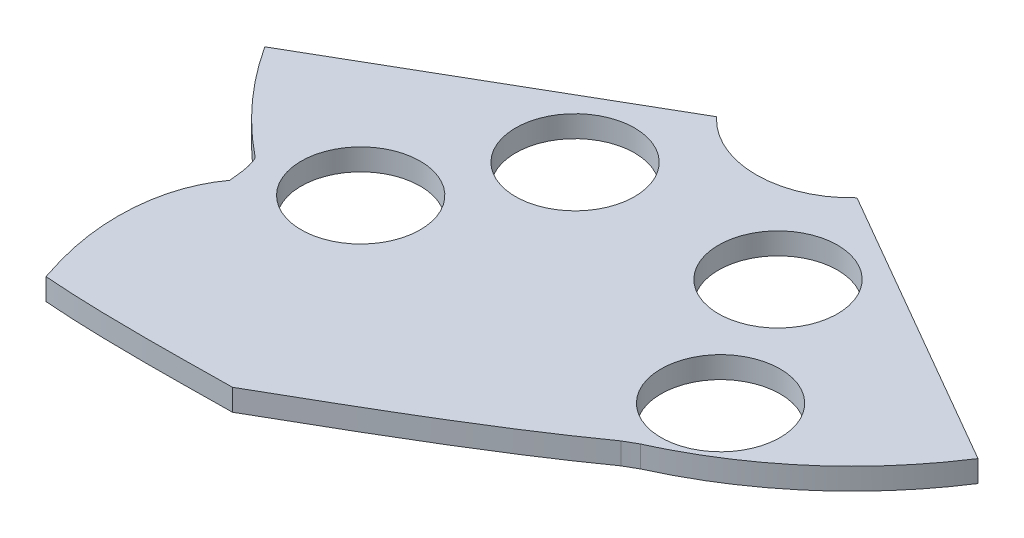
ISO-10303-21;
HEADER;
FILE_DESCRIPTION(('STEP AP214'),'2;1');
FILE_NAME('part.step','',(''),(''),'','','');
FILE_SCHEMA(('AUTOMOTIVE_DESIGN { 1 0 10303 214 1 1 1 1 }'));
ENDSEC;
DATA;
#1=APPLICATION_CONTEXT('core data for automotive mechanical design processes');
#2=APPLICATION_PROTOCOL_DEFINITION('international standard','automotive_design',2000,#1);
#3=PRODUCT_CONTEXT('',#1,'mechanical');
#4=PRODUCT('Part','Part','',(#3));
#5=PRODUCT_RELATED_PRODUCT_CATEGORY('part','',(#4));
#6=PRODUCT_DEFINITION_FORMATION('','',#4);
#7=PRODUCT_DEFINITION_CONTEXT('part definition',#1,'design');
#8=PRODUCT_DEFINITION('design','',#6,#7);
#9=PRODUCT_DEFINITION_SHAPE('','',#8);
#10=(LENGTH_UNIT() NAMED_UNIT(*) SI_UNIT(.MILLI.,.METRE.));
#11=(NAMED_UNIT(*) PLANE_ANGLE_UNIT() SI_UNIT($,.RADIAN.));
#12=(NAMED_UNIT(*) SI_UNIT($,.STERADIAN.) SOLID_ANGLE_UNIT());
#13=UNCERTAINTY_MEASURE_WITH_UNIT(LENGTH_MEASURE(1.E-05),#10,'distance_accuracy_value','');
#14=(GEOMETRIC_REPRESENTATION_CONTEXT(3) GLOBAL_UNCERTAINTY_ASSIGNED_CONTEXT((#13)) GLOBAL_UNIT_ASSIGNED_CONTEXT((#10,
#11,#12)) REPRESENTATION_CONTEXT('',''));
#15=CARTESIAN_POINT('',(0.,0.,0.));
#16=DIRECTION('',(0.,0.,1.));
#17=DIRECTION('',(1.,0.,0.));
#18=AXIS2_PLACEMENT_3D('',#15,#16,#17);
#19=CARTESIAN_POINT('',(-58.197961870647,-95.736,52.6805140965762));
#20=DIRECTION('',(0.,-1.,0.));
#21=DIRECTION('',(0.,0.,-1.));
#22=AXIS2_PLACEMENT_3D('',#19,#20,#21);
#23=PLANE('',#22);
#24=CARTESIAN_POINT('',(18.75,-95.736,32.476));
#25=DIRECTION('',(0.,-1.,0.));
#26=DIRECTION('',(0.,0.,-1.));
#27=AXIS2_PLACEMENT_3D('',#24,#25,#26);
#28=CIRCLE('',#27,10.999845998306);
#29=CARTESIAN_POINT('',(18.75,-95.736,21.476154001694));
#30=VERTEX_POINT('',#29);
#31=EDGE_CURVE('E441',#30,#30,#28,.T.);
#32=ORIENTED_EDGE('',*,*,#31,.F.);
#33=EDGE_LOOP('',(#32));
#34=FACE_BOUND('',#33,.T.);
#35=CARTESIAN_POINT('',(-33.25,-95.736,57.591));
#36=DIRECTION('',(0.,-1.,0.));
#37=DIRECTION('',(0.,0.,-1.));
#38=AXIS2_PLACEMENT_3D('',#35,#36,#37);
#39=CIRCLE('',#38,10.999845998306);
#40=CARTESIAN_POINT('',(-33.25,-95.736,46.591154001694));
#41=VERTEX_POINT('',#40);
#42=EDGE_CURVE('E422',#41,#41,#39,.T.);
#43=ORIENTED_EDGE('',*,*,#42,.F.);
#44=EDGE_LOOP('',(#43));
#45=FACE_BOUND('',#44,.T.);
#46=CARTESIAN_POINT('',(-65.8942438215736,-95.736,42.6629141284688));
#47=CARTESIAN_POINT('',(-64.7481896495349,-95.736,44.4323996427012));
#48=CARTESIAN_POINT('',(-63.5310462821573,-95.736,46.1567714999939));
#49=CARTESIAN_POINT('',(-60.9638535341546,-95.736,49.499221373882));
#50=CARTESIAN_POINT('',(-59.6126875987779,-95.736,51.1179637725432));
#51=CARTESIAN_POINT('',(-55.3684815127835,-95.736,55.8056466661798));
#52=CARTESIAN_POINT('',(-52.2875127768171,-95.736,58.7033318126828));
#53=CARTESIAN_POINT('',(-48.9943120143384,-95.736,61.3338771744565));
#54=B_SPLINE_CURVE_WITH_KNOTS('',3,(#46,#47,#48,#49,#50,#51,#52,#53),.UNSPECIFIED.,.F.,.F.,(4,2,
2,4),(7.65054686269195E-13,0.25,0.5,0.999998540788698),.UNSPECIFIED.);
#55=CARTESIAN_POINT('',(-48.9943120143384,-95.736,61.3338771744565));
#56=VERTEX_POINT('',#55);
#57=CARTESIAN_POINT('',(-65.8942438215736,-95.736,42.6629141284688));
#58=VERTEX_POINT('',#57);
#59=EDGE_CURVE('E378',#56,#58,#54,.F.);
#60=ORIENTED_EDGE('',*,*,#59,.T.);
#61=DIRECTION('',(0.866025113443951,0.,-0.500000502884138));
#62=VECTOR('',#61,1.);
#63=CARTESIAN_POINT('',(-65.8942438215736,-95.736,42.6629141284688));
#64=LINE('',#63,#62);
#65=CARTESIAN_POINT('',(-12.9766531358799,-95.736,12.1108879302399));
#66=VERTEX_POINT('',#65);
#67=EDGE_CURVE('E103',#58,#66,#64,.T.);
#68=ORIENTED_EDGE('',*,*,#67,.T.);
#69=CARTESIAN_POINT('',(0.,-95.736,0.));
#70=DIRECTION('',(0.,1.,0.));
#71=DIRECTION('',(0.,0.,-1.));
#72=AXIS2_PLACEMENT_3D('',#69,#70,#71);
#73=CIRCLE('',#72,17.7501305084715);
#74=CARTESIAN_POINT('',(12.9766531358511,-95.736,12.1108879302707));
#75=VERTEX_POINT('',#74);
#76=EDGE_CURVE('E272',#66,#75,#73,.T.);
#77=ORIENTED_EDGE('',*,*,#76,.T.);
#78=DIRECTION('',(0.866025113442765,0.,0.500000502886192));
#79=VECTOR('',#78,1.);
#80=CARTESIAN_POINT('',(12.9766531358511,-95.736,12.1108879302707));
#81=LINE('',#80,#79);
#82=CARTESIAN_POINT('',(65.8946490574718,-95.736,42.6631480920524));
#83=VERTEX_POINT('',#82);
#84=EDGE_CURVE('E249',#75,#83,#81,.T.);
#85=ORIENTED_EDGE('',*,*,#84,.T.);
#86=CARTESIAN_POINT('',(32.3639071630544,-95.736,71.518722381302));
#87=CARTESIAN_POINT('',(35.7674671190183,-95.736,69.9782224254637));
#88=CARTESIAN_POINT('',(39.0643190275716,-95.736,68.1916483133267));
#89=CARTESIAN_POINT('',(45.364161801316,-95.736,64.1747818871924));
#90=CARTESIAN_POINT('',(48.3714608468154,-95.736,61.9376791964968));
#91=CARTESIAN_POINT('',(54.0374701978777,-95.736,57.063705355286));
#92=CARTESIAN_POINT('',(56.6958287618017,-95.736,54.4237586405179));
#93=CARTESIAN_POINT('',(61.6087710037681,-95.736,48.792570508695));
#94=CARTESIAN_POINT('',(63.8637051430224,-95.736,45.8002856784584));
#95=CARTESIAN_POINT('',(65.8946490574718,-95.736,42.6631480920524));
#96=B_SPLINE_CURVE_WITH_KNOTS('',3,(#86,#87,#88,#89,#90,#91,#92,#93,#94,#95),.UNSPECIFIED.,.F.,
.F.,(4,2,2,2,4),(0.,0.25,0.5,0.75,1.),.UNSPECIFIED.);
#97=CARTESIAN_POINT('',(32.3639071630544,-95.736,71.518722381302));
#98=VERTEX_POINT('',#97);
#99=EDGE_CURVE('E244',#83,#98,#96,.F.);
#100=ORIENTED_EDGE('',*,*,#99,.T.);
#101=CARTESIAN_POINT('',(30.077254884467,-95.736,72.8251652501504));
#102=CARTESIAN_POINT('',(30.1822815859724,-95.736,72.7608434591795));
#103=CARTESIAN_POINT('',(30.3942944838775,-95.736,72.6309999584621));
#104=CARTESIAN_POINT('',(30.8284754594415,-95.736,72.3741288061626));
#105=CARTESIAN_POINT('',(31.3248703130237,-95.736,72.089895879078));
#106=CARTESIAN_POINT('',(31.8747778403471,-95.736,71.7837839646905));
#107=CARTESIAN_POINT('',(32.2031671533857,-95.736,71.6058281129184));
#108=CARTESIAN_POINT('',(32.3639060046392,-95.736,71.5187229056173));
#109=B_SPLINE_CURVE_WITH_KNOTS('',3,(#101,#102,#103,#104,#105,#106,#107,#108),.UNSPECIFIED.,.F.,
.F.,(4,1,1,1,1,4),(0.,0.14027370511467,0.283164429956061,0.574573360474114,0.791759110522628,
0.999991092705754),.UNSPECIFIED.);
#110=CARTESIAN_POINT('',(30.077254884467,-95.736,72.8251652501504));
#111=VERTEX_POINT('',#110);
#112=EDGE_CURVE('E321',#98,#111,#109,.F.);
#113=ORIENTED_EDGE('',*,*,#112,.T.);
#114=CARTESIAN_POINT('',(-14.3951371400716,-95.736,100.130753915315));
#115=CARTESIAN_POINT('',(-13.3505194752669,-95.736,99.5327428682483));
#116=CARTESIAN_POINT('',(-11.2568374365112,-95.736,98.3341751717552));
#117=CARTESIAN_POINT('',(-5.7832605826681,-95.736,95.200447991266));
#118=CARTESIAN_POINT('',(1.91635834766982,-95.736,90.7612949765773));
#119=CARTESIAN_POINT('',(10.0739724808193,-95.736,85.8977908397055));
#120=CARTESIAN_POINT('',(16.5511450939432,-95.736,81.8774082418066));
#121=CARTESIAN_POINT('',(20.209891139743,-95.736,79.5296141676809));
#122=CARTESIAN_POINT('',(22.7424082311937,-95.736,77.8604895717903));
#123=CARTESIAN_POINT('',(24.0005885586283,-95.736,77.0220259862925));
#124=CARTESIAN_POINT('',(25.2447472238097,-95.736,76.1833702154967));
#125=CARTESIAN_POINT('',(26.4745670243228,-95.736,75.3446559314633));
#126=CARTESIAN_POINT('',(27.6895914879721,-95.736,74.5057998801645));
#127=CARTESIAN_POINT('',(28.8899949092457,-95.736,73.6675717894459));
#128=CARTESIAN_POINT('',(29.6826448629567,-95.736,73.1051561953971));
#129=CARTESIAN_POINT('',(30.0772548844666,-95.736,72.8251652501507));
#130=B_SPLINE_CURVE_WITH_KNOTS('',3,(#114,#115,#116,#117,#118,#119,#120,#121,#122,#123,#124,
#125,#126,#127,#128,#129),.UNSPECIFIED.,.F.,.F.,(4,1,1,1,1,1,1,1,1,1,1,1,1,4),
(-3.13787668737575E-07,0.069165824377653,0.138626387680094,0.362423795133444,0.579865388634984,
0.684327218445521,0.800475338629621,0.829652659074383,0.858614847466929,0.88735588780722,
0.915870095582063,0.944152110308575,0.972196886922019,1.),.UNSPECIFIED.);
#131=CARTESIAN_POINT('',(-14.3951371400716,-95.736,100.130753915315));
#132=VERTEX_POINT('',#131);
#133=EDGE_CURVE('E129',#111,#132,#130,.F.);
#134=ORIENTED_EDGE('',*,*,#133,.T.);
#135=CARTESIAN_POINT('',(-1663.16783202955,-95.736,1225.68534199864));
#136=CARTESIAN_POINT('',(2145.36043449303,-95.736,-1017.7020330919));
#137=CARTESIAN_POINT('',(-2167.35248932832,-95.736,1203.40323210772));
#138=CARTESIAN_POINT('',(1630.56413160656,-95.736,-981.965569594921));
#139=B_SPLINE_CURVE_WITH_KNOTS('',3,(#135,#136,#137,#138),.UNSPECIFIED.,.F.,.F.,(4,4),
(-10.3601295168167,10.248315428923),.UNSPECIFIED.);
#140=CARTESIAN_POINT('',(-49.3379755412991,-95.736,99.655194420379));
#141=VERTEX_POINT('',#140);
#142=EDGE_CURVE('E122',#132,#141,#139,.T.);
#143=ORIENTED_EDGE('',*,*,#142,.T.);
#144=CARTESIAN_POINT('',(-47.7731350411802,-95.736,67.2598180144932));
#145=CARTESIAN_POINT('',(-47.9488920780134,-95.736,67.508087103161));
#146=CARTESIAN_POINT('',(-48.2990703182446,-95.736,68.0027376783242));
#147=CARTESIAN_POINT('',(-48.7818545278718,-95.736,68.7698311324327));
#148=CARTESIAN_POINT('',(-49.2316385330056,-95.736,69.550075772291));
#149=CARTESIAN_POINT('',(-49.64652227975,-95.736,70.3447350824898));
#150=CARTESIAN_POINT('',(-50.2947651724595,-95.736,71.7163706723563));
#151=CARTESIAN_POINT('',(-51.0575449694001,-95.736,73.7324366606143));
#152=CARTESIAN_POINT('',(-51.7478612752798,-95.736,76.4085463161939));
#153=CARTESIAN_POINT('',(-52.1817330682431,-95.736,79.1581680205615));
#154=CARTESIAN_POINT('',(-52.3812092269579,-95.736,81.9074536027439));
#155=CARTESIAN_POINT('',(-52.3792306383951,-95.736,84.7012368943906));
#156=CARTESIAN_POINT('',(-52.190220937294,-95.736,87.4607295575721));
#157=CARTESIAN_POINT('',(-51.8198059858523,-95.736,90.2057752203513));
#158=CARTESIAN_POINT('',(-51.3808357080297,-95.736,92.4425554728793));
#159=CARTESIAN_POINT('',(-50.9595894478412,-95.736,94.212202091745));
#160=CARTESIAN_POINT('',(-50.495357558151,-95.736,95.9715075066716));
#161=CARTESIAN_POINT('',(-50.0251720143132,-95.736,97.5398380463112));
#162=CARTESIAN_POINT('',(-49.5850622867533,-95.736,98.9097693595326));
#163=CARTESIAN_POINT('',(-49.4187341675323,-95.736,99.4115572970555));
#164=CARTESIAN_POINT('',(-49.3379755413036,-95.736,99.6551944203653));
#165=B_SPLINE_CURVE_WITH_KNOTS('',3,(#144,#145,#146,#147,#148,#149,#150,#151,#152,#153,#154,
#155,#156,#157,#158,#159,#160,#161,#162,#163,#164),.UNSPECIFIED.,.F.,.F.,(4,1,1,1,1,1,1,1,1,1,1,
1,1,1,1,1,1,1,4),(4.13669098975333E-13,0.0270960399667382,0.0539860901563884,0.0807130731809925,
0.107315140554032,0.133826285257707,0.215850018485879,0.298875168999364,0.379627917207236,
0.463525556109156,0.544195423014069,0.628342545375611,0.709755155334879,0.790814533726315,
0.831306351379741,0.871807447939199,0.952903982510329,0.977133406961988,1.00000061073529),.UNSPECIFIED.);
#166=CARTESIAN_POINT('',(-47.7731350411802,-95.736,67.2598180144931));
#167=VERTEX_POINT('',#166);
#168=EDGE_CURVE('E126',#141,#167,#165,.F.);
#169=ORIENTED_EDGE('',*,*,#168,.T.);
#170=CARTESIAN_POINT('',(-48.9943120143384,-95.736,61.3338771744565));
#171=CARTESIAN_POINT('',(-48.9594289712213,-95.736,61.4086133330928));
#172=CARTESIAN_POINT('',(-48.8902308995571,-95.736,61.5568686915449));
#173=CARTESIAN_POINT('',(-48.7948156576452,-95.736,61.7808521175198));
#174=CARTESIAN_POINT('',(-48.688599961713,-95.736,62.0482778834496));
#175=CARTESIAN_POINT('',(-48.5754372060929,-95.736,62.36412601051));
#176=CARTESIAN_POINT('',(-48.4238675008309,-95.736,62.8447534959303));
#177=CARTESIAN_POINT('',(-48.2640564263806,-95.736,63.4663486232066));
#178=CARTESIAN_POINT('',(-48.0681153772079,-95.736,64.4750318438346));
#179=CARTESIAN_POINT('',(-47.9401618449875,-95.736,65.5041010084014));
#180=CARTESIAN_POINT('',(-47.8411342939389,-95.736,66.5159136706272));
#181=CARTESIAN_POINT('',(-47.7954209086754,-95.736,67.0160128680909));
#182=CARTESIAN_POINT('',(-47.7731350411802,-95.736,67.2598180144931));
#183=B_SPLINE_CURVE_WITH_KNOTS('',3,(#170,#171,#172,#173,#174,#175,#176,#177,#178,#179,#180,
#181,#182),.UNSPECIFIED.,.F.,.F.,(4,1,1,1,1,1,1,1,1,1,4),(4.44540768462787E-06,
0.0406659330463773,0.0806653133872965,0.120017426231064,0.182525067935943,0.246033800807224,
0.368437163746651,0.498716091757652,0.752408434385871,0.879295752821847,1.),.UNSPECIFIED.);
#184=EDGE_CURVE('E51',#167,#56,#183,.F.);
#185=ORIENTED_EDGE('',*,*,#184,.T.);
#186=EDGE_LOOP('',(#60,#68,#77,#85,#100,#113,#134,#143,#169,#185));
#187=FACE_BOUND('',#186,.T.);
#188=CARTESIAN_POINT('',(33.25,-95.736,57.591));
#189=DIRECTION('',(0.,-1.,0.));
#190=DIRECTION('',(0.,0.,-1.));
#191=AXIS2_PLACEMENT_3D('',#188,#189,#190);
#192=CIRCLE('',#191,10.999845998306);
#193=CARTESIAN_POINT('',(33.25,-95.736,46.591154001694));
#194=VERTEX_POINT('',#193);
#195=EDGE_CURVE('E429',#194,#194,#192,.T.);
#196=ORIENTED_EDGE('',*,*,#195,.F.);
#197=EDGE_LOOP('',(#196));
#198=FACE_BOUND('',#197,.T.);
#199=CARTESIAN_POINT('',(-18.75,-95.736,32.476));
#200=DIRECTION('',(0.,-1.,0.));
#201=DIRECTION('',(0.,0.,-1.));
#202=AXIS2_PLACEMENT_3D('',#199,#200,#201);
#203=CIRCLE('',#202,10.999845998306);
#204=CARTESIAN_POINT('',(-18.75,-95.736,21.476154001694));
#205=VERTEX_POINT('',#204);
#206=EDGE_CURVE('E447',#205,#205,#203,.T.);
#207=ORIENTED_EDGE('',*,*,#206,.F.);
#208=EDGE_LOOP('',(#207));
#209=FACE_BOUND('',#208,.T.);
#210=ADVANCED_FACE('F30',(#34,#45,#187,#198,#209),#23,.T.);
#211=CARTESIAN_POINT('',(-58.197961870647,-91.736,52.6805140965762));
#212=DIRECTION('',(0.,-1.,0.));
#213=DIRECTION('',(0.,0.,-1.));
#214=AXIS2_PLACEMENT_3D('',#211,#212,#213);
#215=PLANE('',#214);
#216=CARTESIAN_POINT('',(18.75,-91.736,32.476));
#217=DIRECTION('',(0.,-1.,0.));
#218=DIRECTION('',(0.,0.,-1.));
#219=AXIS2_PLACEMENT_3D('',#216,#217,#218);
#220=CIRCLE('',#219,10.999845998306);
#221=CARTESIAN_POINT('',(18.75,-91.736,21.476154001694));
#222=VERTEX_POINT('',#221);
#223=EDGE_CURVE('E444',#222,#222,#220,.T.);
#224=ORIENTED_EDGE('',*,*,#223,.T.);
#225=EDGE_LOOP('',(#224));
#226=FACE_BOUND('',#225,.T.);
#227=CARTESIAN_POINT('',(-33.25,-91.736,57.591));
#228=DIRECTION('',(0.,-1.,0.));
#229=DIRECTION('',(0.,0.,-1.));
#230=AXIS2_PLACEMENT_3D('',#227,#228,#229);
#231=CIRCLE('',#230,10.999845998306);
#232=CARTESIAN_POINT('',(-33.25,-91.736,46.591154001694));
#233=VERTEX_POINT('',#232);
#234=EDGE_CURVE('E424',#233,#233,#231,.T.);
#235=ORIENTED_EDGE('',*,*,#234,.T.);
#236=EDGE_LOOP('',(#235));
#237=FACE_BOUND('',#236,.T.);
#238=CARTESIAN_POINT('',(-48.9943120143384,-91.736,61.3338771744565));
#239=CARTESIAN_POINT('',(-52.2875127768171,-91.736,58.7033318126828));
#240=CARTESIAN_POINT('',(-55.3684815127835,-91.736,55.8056466661798));
#241=CARTESIAN_POINT('',(-59.6126875987779,-91.736,51.1179637725432));
#242=CARTESIAN_POINT('',(-60.9638535341546,-91.736,49.499221373882));
#243=CARTESIAN_POINT('',(-63.5310462821573,-91.736,46.1567714999939));
#244=CARTESIAN_POINT('',(-64.7481896495349,-91.736,44.4323996427012));
#245=CARTESIAN_POINT('',(-65.8942438215736,-91.736,42.6629141284688));
#246=B_SPLINE_CURVE_WITH_KNOTS('',3,(#238,#239,#240,#241,#242,#243,#244,#245),.UNSPECIFIED.,.F.,
.F.,(4,2,2,4),(7.65061180345071E-13,0.499998540789463,0.749998540789463,0.999998540788698),.UNSPECIFIED.);
#247=CARTESIAN_POINT('',(-48.9943120143384,-91.736,61.3338771744565));
#248=VERTEX_POINT('',#247);
#249=CARTESIAN_POINT('',(-65.8942438215736,-91.736,42.6629141284688));
#250=VERTEX_POINT('',#249);
#251=EDGE_CURVE('E405',#248,#250,#246,.T.);
#252=ORIENTED_EDGE('',*,*,#251,.F.);
#253=CARTESIAN_POINT('',(-47.7731350411802,-91.7360000000001,67.2598180144931));
#254=CARTESIAN_POINT('',(-47.7954209086754,-91.7360000000001,67.0160128680909));
#255=CARTESIAN_POINT('',(-47.8411342939389,-91.7360000000001,66.5159136706272));
#256=CARTESIAN_POINT('',(-47.9401618449875,-91.7360000000001,65.5041010084014));
#257=CARTESIAN_POINT('',(-48.0681153772079,-91.7360000000001,64.4750318438346));
#258=CARTESIAN_POINT('',(-48.2640564263806,-91.7360000000001,63.4663486232066));
#259=CARTESIAN_POINT('',(-48.4238675008309,-91.7360000000001,62.8447534959303));
#260=CARTESIAN_POINT('',(-48.5754372060929,-91.7360000000001,62.36412601051));
#261=CARTESIAN_POINT('',(-48.688599961713,-91.7360000000001,62.0482778834496));
#262=CARTESIAN_POINT('',(-48.7948156576452,-91.7360000000001,61.7808521175198));
#263=CARTESIAN_POINT('',(-48.8902308995571,-91.7360000000001,61.5568686915449));
#264=CARTESIAN_POINT('',(-48.9594289712213,-91.7360000000001,61.4086133330928));
#265=CARTESIAN_POINT('',(-48.9943120143384,-91.7360000000001,61.3338771744565));
#266=B_SPLINE_CURVE_WITH_KNOTS('',3,(#253,#254,#255,#256,#257,#258,#259,#260,#261,#262,#263,
#264,#265),.UNSPECIFIED.,.F.,.F.,(4,1,1,1,1,1,1,1,1,1,4),(4.44540768453168E-06,
0.120708692585838,0.247596011021814,0.501288353650033,0.631567281661033,0.75397064460046,
0.817479377471742,0.879987019176621,0.919339132020388,0.959338512361307,1.),.UNSPECIFIED.);
#267=CARTESIAN_POINT('',(-47.7731350411802,-91.736,67.2598180144931));
#268=VERTEX_POINT('',#267);
#269=EDGE_CURVE('E94',#268,#248,#266,.T.);
#270=ORIENTED_EDGE('',*,*,#269,.F.);
#271=CARTESIAN_POINT('',(-49.3379755413036,-91.736,99.6551944203653));
#272=CARTESIAN_POINT('',(-49.4187341675323,-91.736,99.4115572970555));
#273=CARTESIAN_POINT('',(-49.5850622867533,-91.736,98.9097693595326));
#274=CARTESIAN_POINT('',(-50.0251720143132,-91.736,97.5398380463112));
#275=CARTESIAN_POINT('',(-50.495357558151,-91.736,95.9715075066716));
#276=CARTESIAN_POINT('',(-50.9595894478412,-91.736,94.212202091745));
#277=CARTESIAN_POINT('',(-51.3808357080297,-91.736,92.4425554728793));
#278=CARTESIAN_POINT('',(-51.8198059858523,-91.736,90.2057752203513));
#279=CARTESIAN_POINT('',(-52.190220937294,-91.736,87.4607295575721));
#280=CARTESIAN_POINT('',(-52.3792306383951,-91.736,84.7012368943906));
#281=CARTESIAN_POINT('',(-52.3812092269579,-91.736,81.9074536027439));
#282=CARTESIAN_POINT('',(-52.1817330682431,-91.736,79.1581680205615));
#283=CARTESIAN_POINT('',(-51.7478612752798,-91.736,76.4085463161939));
#284=CARTESIAN_POINT('',(-51.0575449694001,-91.736,73.7324366606143));
#285=CARTESIAN_POINT('',(-50.2947651724595,-91.736,71.7163706723563));
#286=CARTESIAN_POINT('',(-49.64652227975,-91.736,70.3447350824898));
#287=CARTESIAN_POINT('',(-49.2316385330056,-91.736,69.550075772291));
#288=CARTESIAN_POINT('',(-48.7818545278718,-91.736,68.7698311324327));
#289=CARTESIAN_POINT('',(-48.2990703182446,-91.736,68.0027376783242));
#290=CARTESIAN_POINT('',(-47.9488920780134,-91.736,67.508087103161));
#291=CARTESIAN_POINT('',(-47.7731350411802,-91.736,67.2598180144932));
#292=B_SPLINE_CURVE_WITH_KNOTS('',3,(#271,#272,#273,#274,#275,#276,#277,#278,#279,#280,#281,
#282,#283,#284,#285,#286,#287,#288,#289,#290,#291),.UNSPECIFIED.,.F.,.F.,(4,1,1,1,1,1,1,1,1,1,1,
1,1,1,1,1,1,1,4),(4.13750522558487E-13,0.0228672037737133,0.0470966282253719,0.128193162796502,
0.16869425935596,0.209186077009387,0.290245455400823,0.37165806536009,0.455805187721632,
0.536475054626545,0.620372693528466,0.701125441736337,0.784150592249823,0.866174325477994,
0.892685470181669,0.919287537554709,0.946014520579313,0.972904570768963,1.00000061073529),.UNSPECIFIED.);
#293=CARTESIAN_POINT('',(-49.3379755412991,-91.736,99.655194420379));
#294=VERTEX_POINT('',#293);
#295=EDGE_CURVE('E87',#294,#268,#292,.T.);
#296=ORIENTED_EDGE('',*,*,#295,.F.);
#297=CARTESIAN_POINT('',(-1663.16783202955,-91.736,1225.68534199864));
#298=CARTESIAN_POINT('',(2145.36043449303,-91.736,-1017.7020330919));
#299=CARTESIAN_POINT('',(-2167.35248932832,-91.736,1203.40323210772));
#300=CARTESIAN_POINT('',(1630.56413160656,-91.736,-981.965569594921));
#301=B_SPLINE_CURVE_WITH_KNOTS('',3,(#297,#298,#299,#300),.UNSPECIFIED.,.F.,.F.,(4,4),
(-10.3601295168167,10.248315428923),.UNSPECIFIED.);
#302=CARTESIAN_POINT('',(-14.3951371400716,-91.736,100.130753915315));
#303=VERTEX_POINT('',#302);
#304=EDGE_CURVE('E138',#303,#294,#301,.T.);
#305=ORIENTED_EDGE('',*,*,#304,.F.);
#306=CARTESIAN_POINT('',(30.0772548844666,-91.7359999999999,72.8251652501507));
#307=CARTESIAN_POINT('',(29.6826448629567,-91.7359999999999,73.1051561953971));
#308=CARTESIAN_POINT('',(28.8899949092457,-91.7359999999999,73.6675717894459));
#309=CARTESIAN_POINT('',(27.6895914879721,-91.7359999999999,74.5057998801645));
#310=CARTESIAN_POINT('',(26.4745670243228,-91.7359999999999,75.3446559314633));
#311=CARTESIAN_POINT('',(25.2447472238097,-91.7359999999999,76.1833702154967));
#312=CARTESIAN_POINT('',(24.0005885586283,-91.7359999999999,77.0220259862925));
#313=CARTESIAN_POINT('',(22.7424082311937,-91.7359999999999,77.8604895717903));
#314=CARTESIAN_POINT('',(20.209891139743,-91.7359999999999,79.5296141676809));
#315=CARTESIAN_POINT('',(16.5511450939432,-91.7359999999999,81.8774082418066));
#316=CARTESIAN_POINT('',(10.0739724808193,-91.7359999999999,85.8977908397055));
#317=CARTESIAN_POINT('',(1.91635834766982,-91.7359999999999,90.7612949765773));
#318=CARTESIAN_POINT('',(-5.7832605826681,-91.7359999999999,95.200447991266));
#319=CARTESIAN_POINT('',(-11.2568374365112,-91.7359999999999,98.3341751717552));
#320=CARTESIAN_POINT('',(-13.3505194752669,-91.7359999999999,99.5327428682483));
#321=CARTESIAN_POINT('',(-14.3951371400716,-91.7359999999999,100.130753915315));
#322=B_SPLINE_CURVE_WITH_KNOTS('',3,(#306,#307,#308,#309,#310,#311,#312,#313,#314,#315,#316,
#317,#318,#319,#320,#321),.UNSPECIFIED.,.F.,.F.,(4,1,1,1,1,1,1,1,1,1,1,1,1,4),
(-3.13787668731761E-07,0.027802799290312,0.0558475759037566,0.0841295906302687,
0.112643798405111,0.141384838745402,0.170347027137949,0.199524347582711,0.31567246776681,
0.420134297577347,0.637575891078887,0.861373298532237,0.930833861834678,1.),.UNSPECIFIED.);
#323=CARTESIAN_POINT('',(30.077254884467,-91.736,72.8251652501504));
#324=VERTEX_POINT('',#323);
#325=EDGE_CURVE('E312',#324,#303,#322,.T.);
#326=ORIENTED_EDGE('',*,*,#325,.F.);
#327=CARTESIAN_POINT('',(32.3639060046392,-91.736,71.5187229056173));
#328=CARTESIAN_POINT('',(32.2031671533857,-91.736,71.6058281129184));
#329=CARTESIAN_POINT('',(31.8747778403471,-91.736,71.7837839646905));
#330=CARTESIAN_POINT('',(31.3248703130237,-91.736,72.089895879078));
#331=CARTESIAN_POINT('',(30.8284754594415,-91.736,72.3741288061626));
#332=CARTESIAN_POINT('',(30.3942944838775,-91.736,72.6309999584621));
#333=CARTESIAN_POINT('',(30.1822815859724,-91.736,72.7608434591795));
#334=CARTESIAN_POINT('',(30.077254884467,-91.736,72.8251652501504));
#335=B_SPLINE_CURVE_WITH_KNOTS('',3,(#327,#328,#329,#330,#331,#332,#333,#334),.UNSPECIFIED.,.F.,
.F.,(4,1,1,1,1,4),(0.,0.208231982183126,0.42541773223164,0.716826662749693,0.859717387591085,
0.999991092705754),.UNSPECIFIED.);
#336=CARTESIAN_POINT('',(32.3639071630544,-91.736,71.518722381302));
#337=VERTEX_POINT('',#336);
#338=EDGE_CURVE('E327',#337,#324,#335,.T.);
#339=ORIENTED_EDGE('',*,*,#338,.F.);
#340=CARTESIAN_POINT('',(65.8946490574718,-91.736,42.6631480920524));
#341=CARTESIAN_POINT('',(63.8637051430224,-91.736,45.8002856784584));
#342=CARTESIAN_POINT('',(61.6087710037681,-91.736,48.792570508695));
#343=CARTESIAN_POINT('',(56.6958287618017,-91.736,54.4237586405179));
#344=CARTESIAN_POINT('',(54.0374701978777,-91.736,57.063705355286));
#345=CARTESIAN_POINT('',(48.3714608468154,-91.736,61.9376791964968));
#346=CARTESIAN_POINT('',(45.364161801316,-91.736,64.1747818871924));
#347=CARTESIAN_POINT('',(39.0643190275716,-91.736,68.1916483133267));
#348=CARTESIAN_POINT('',(35.7674671190183,-91.736,69.9782224254637));
#349=CARTESIAN_POINT('',(32.3639071630544,-91.736,71.518722381302));
#350=B_SPLINE_CURVE_WITH_KNOTS('',3,(#340,#341,#342,#343,#344,#345,#346,#347,#348,#349),
.UNSPECIFIED.,.F.,.F.,(4,2,2,2,4),(0.,0.25,0.5,0.75,1.),.UNSPECIFIED.);
#351=CARTESIAN_POINT('',(65.8946490574718,-91.736,42.6631480920524));
#352=VERTEX_POINT('',#351);
#353=EDGE_CURVE('E363',#352,#337,#350,.T.);
#354=ORIENTED_EDGE('',*,*,#353,.F.);
#355=DIRECTION('',(0.866025113442765,0.,0.500000502886192));
#356=VECTOR('',#355,1.);
#357=CARTESIAN_POINT('',(12.9766531358511,-91.736,12.1108879302707));
#358=LINE('',#357,#356);
#359=CARTESIAN_POINT('',(12.9766531358511,-91.736,12.1108879302707));
#360=VERTEX_POINT('',#359);
#361=EDGE_CURVE('E188',#360,#352,#358,.T.);
#362=ORIENTED_EDGE('',*,*,#361,.F.);
#363=CARTESIAN_POINT('',(0.,-91.736,0.));
#364=DIRECTION('',(0.,1.,0.));
#365=DIRECTION('',(0.,0.,-1.));
#366=AXIS2_PLACEMENT_3D('',#363,#364,#365);
#367=CIRCLE('',#366,17.7501305084715);
#368=CARTESIAN_POINT('',(-12.9766531358799,-91.736,12.1108879302399));
#369=VERTEX_POINT('',#368);
#370=EDGE_CURVE('E183',#369,#360,#367,.T.);
#371=ORIENTED_EDGE('',*,*,#370,.F.);
#372=DIRECTION('',(0.866025113443951,0.,-0.500000502884138));
#373=VECTOR('',#372,1.);
#374=CARTESIAN_POINT('',(-65.8942438215736,-91.736,42.6629141284688));
#375=LINE('',#374,#373);
#376=EDGE_CURVE('E189',#250,#369,#375,.T.);
#377=ORIENTED_EDGE('',*,*,#376,.F.);
#378=EDGE_LOOP('',(#252,#270,#296,#305,#326,#339,#354,#362,#371,#377));
#379=FACE_BOUND('',#378,.T.);
#380=CARTESIAN_POINT('',(33.25,-91.736,57.591));
#381=DIRECTION('',(0.,-1.,0.));
#382=DIRECTION('',(0.,0.,-1.));
#383=AXIS2_PLACEMENT_3D('',#380,#381,#382);
#384=CIRCLE('',#383,10.999845998306);
#385=CARTESIAN_POINT('',(33.25,-91.736,46.591154001694));
#386=VERTEX_POINT('',#385);
#387=EDGE_CURVE('E432',#386,#386,#384,.T.);
#388=ORIENTED_EDGE('',*,*,#387,.T.);
#389=EDGE_LOOP('',(#388));
#390=FACE_BOUND('',#389,.T.);
#391=CARTESIAN_POINT('',(-18.75,-91.736,32.476));
#392=DIRECTION('',(0.,-1.,0.));
#393=DIRECTION('',(0.,0.,-1.));
#394=AXIS2_PLACEMENT_3D('',#391,#392,#393);
#395=CIRCLE('',#394,10.999845998306);
#396=CARTESIAN_POINT('',(-18.75,-91.736,21.476154001694));
#397=VERTEX_POINT('',#396);
#398=EDGE_CURVE('E450',#397,#397,#395,.T.);
#399=ORIENTED_EDGE('',*,*,#398,.T.);
#400=EDGE_LOOP('',(#399));
#401=FACE_BOUND('',#400,.T.);
#402=ADVANCED_FACE('F208',(#226,#237,#379,#390,#401),#215,.F.);
#403=CARTESIAN_POINT('',(-48.9943120143384,-95.736,61.3338771744565));
#404=CARTESIAN_POINT('',(-52.2875127768171,-95.736,58.7033318126828));
#405=CARTESIAN_POINT('',(-55.3684815127835,-95.736,55.8056466661798));
#406=CARTESIAN_POINT('',(-59.6126875987779,-95.736,51.1179637725432));
#407=CARTESIAN_POINT('',(-60.9638535341546,-95.736,49.499221373882));
#408=CARTESIAN_POINT('',(-63.5310462821573,-95.736,46.1567714999939));
#409=CARTESIAN_POINT('',(-64.7481896495349,-95.736,44.4323996427012));
#410=CARTESIAN_POINT('',(-65.8942438215736,-95.736,42.6629141284688));
#411=B_SPLINE_CURVE_WITH_KNOTS('',3,(#403,#404,#405,#406,#407,#408,#409,#410),.UNSPECIFIED.,.F.,
.F.,(4,2,2,4),(7.65061180345071E-13,0.499998540789463,0.749998540789463,0.999998540788698),.UNSPECIFIED.);
#412=DIRECTION('',(0.,1.,0.));
#413=VECTOR('',#412,1.);
#414=SURFACE_OF_LINEAR_EXTRUSION('',#411,#413);
#415=ORIENTED_EDGE('',*,*,#251,.T.);
#416=DIRECTION('',(0.,1.,0.));
#417=VECTOR('',#416,1.);
#418=CARTESIAN_POINT('',(-65.8942438215736,-95.736,42.6629141284688));
#419=LINE('',#418,#417);
#420=EDGE_CURVE('E11',#58,#250,#419,.T.);
#421=ORIENTED_EDGE('',*,*,#420,.F.);
#422=ORIENTED_EDGE('',*,*,#59,.F.);
#423=DIRECTION('',(0.,1.,0.));
#424=VECTOR('',#423,1.);
#425=CARTESIAN_POINT('',(-48.9943120143384,-95.736,61.3338771744565));
#426=LINE('',#425,#424);
#427=EDGE_CURVE('E652',#56,#248,#426,.T.);
#428=ORIENTED_EDGE('',*,*,#427,.T.);
#429=EDGE_LOOP('',(#415,#421,#422,#428));
#430=FACE_BOUND('',#429,.T.);
#431=ADVANCED_FACE('F32',(#430),#414,.F.);
#432=CARTESIAN_POINT('',(-65.8942438215736,-95.736,42.6629141284688));
#433=DIRECTION('',(0.500000502884138,0.,0.866025113443951));
#434=DIRECTION('',(0.866025113443951,0.,-0.500000502884138));
#435=AXIS2_PLACEMENT_3D('',#432,#433,#434);
#436=PLANE('',#435);
#437=ORIENTED_EDGE('',*,*,#376,.T.);
#438=DIRECTION('',(0.,1.,0.));
#439=VECTOR('',#438,1.);
#440=CARTESIAN_POINT('',(-12.9766531358799,-95.736,12.1108879302399));
#441=LINE('',#440,#439);
#442=EDGE_CURVE('E42',#66,#369,#441,.T.);
#443=ORIENTED_EDGE('',*,*,#442,.F.);
#444=ORIENTED_EDGE('',*,*,#67,.F.);
#445=ORIENTED_EDGE('',*,*,#420,.T.);
#446=EDGE_LOOP('',(#437,#443,#444,#445));
#447=FACE_BOUND('',#446,.T.);
#448=ADVANCED_FACE('F469',(#447),#436,.F.);
#449=CARTESIAN_POINT('',(0.,-95.736,0.));
#450=DIRECTION('',(0.,1.,0.));
#451=DIRECTION('',(0.,0.,1.));
#452=AXIS2_PLACEMENT_3D('',#449,#450,#451);
#453=CYLINDRICAL_SURFACE('',#452,17.7501305084715);
#454=ORIENTED_EDGE('',*,*,#370,.T.);
#455=DIRECTION('',(0.,1.,0.));
#456=VECTOR('',#455,1.);
#457=CARTESIAN_POINT('',(12.9766531358511,-95.736,12.1108879302707));
#458=LINE('',#457,#456);
#459=EDGE_CURVE('E190',#75,#360,#458,.T.);
#460=ORIENTED_EDGE('',*,*,#459,.F.);
#461=ORIENTED_EDGE('',*,*,#76,.F.);
#462=ORIENTED_EDGE('',*,*,#442,.T.);
#463=EDGE_LOOP('',(#454,#460,#461,#462));
#464=FACE_BOUND('',#463,.T.);
#465=ADVANCED_FACE('F517',(#464),#453,.F.);
#466=CARTESIAN_POINT('',(12.9766531358511,-95.736,12.1108879302707));
#467=DIRECTION('',(-0.500000502886193,0.,0.866025113442765));
#468=DIRECTION('',(0.866025113442765,0.,0.500000502886193));
#469=AXIS2_PLACEMENT_3D('',#466,#467,#468);
#470=PLANE('',#469);
#471=ORIENTED_EDGE('',*,*,#361,.T.);
#472=DIRECTION('',(0.,1.,0.));
#473=VECTOR('',#472,1.);
#474=CARTESIAN_POINT('',(65.8946490574718,-95.736,42.6631480920524));
#475=LINE('',#474,#473);
#476=EDGE_CURVE('E193',#83,#352,#475,.T.);
#477=ORIENTED_EDGE('',*,*,#476,.F.);
#478=ORIENTED_EDGE('',*,*,#84,.F.);
#479=ORIENTED_EDGE('',*,*,#459,.T.);
#480=EDGE_LOOP('',(#471,#477,#478,#479));
#481=FACE_BOUND('',#480,.T.);
#482=ADVANCED_FACE('F263',(#481),#470,.F.);
#483=CARTESIAN_POINT('',(65.8946490574718,-95.736,42.6631480920524));
#484=CARTESIAN_POINT('',(63.8637051430224,-95.736,45.8002856784584));
#485=CARTESIAN_POINT('',(61.6087710037681,-95.736,48.792570508695));
#486=CARTESIAN_POINT('',(56.6958287618017,-95.736,54.4237586405179));
#487=CARTESIAN_POINT('',(54.0374701978777,-95.736,57.063705355286));
#488=CARTESIAN_POINT('',(48.3714608468154,-95.736,61.9376791964968));
#489=CARTESIAN_POINT('',(45.364161801316,-95.736,64.1747818871924));
#490=CARTESIAN_POINT('',(39.0643190275716,-95.736,68.1916483133267));
#491=CARTESIAN_POINT('',(35.7674671190183,-95.736,69.9782224254637));
#492=CARTESIAN_POINT('',(32.3639071630544,-95.736,71.518722381302));
#493=B_SPLINE_CURVE_WITH_KNOTS('',3,(#483,#484,#485,#486,#487,#488,#489,#490,#491,#492),
.UNSPECIFIED.,.F.,.F.,(4,2,2,2,4),(0.,0.25,0.5,0.75,1.),.UNSPECIFIED.);
#494=DIRECTION('',(0.,1.,0.));
#495=VECTOR('',#494,1.);
#496=SURFACE_OF_LINEAR_EXTRUSION('',#493,#495);
#497=ORIENTED_EDGE('',*,*,#353,.T.);
#498=DIRECTION('',(0.,1.,0.));
#499=VECTOR('',#498,1.);
#500=CARTESIAN_POINT('',(32.3639071630544,-95.736,71.518722381302));
#501=LINE('',#500,#499);
#502=EDGE_CURVE('E329',#98,#337,#501,.T.);
#503=ORIENTED_EDGE('',*,*,#502,.F.);
#504=ORIENTED_EDGE('',*,*,#99,.F.);
#505=ORIENTED_EDGE('',*,*,#476,.T.);
#506=EDGE_LOOP('',(#497,#503,#504,#505));
#507=FACE_BOUND('',#506,.T.);
#508=ADVANCED_FACE('F251',(#507),#496,.F.);
#509=CARTESIAN_POINT('',(32.3639060046392,-95.736,71.5187229056173));
#510=CARTESIAN_POINT('',(32.2031671533857,-95.736,71.6058281129184));
#511=CARTESIAN_POINT('',(31.8747778403471,-95.736,71.7837839646905));
#512=CARTESIAN_POINT('',(31.3248703130237,-95.736,72.089895879078));
#513=CARTESIAN_POINT('',(30.8284754594415,-95.736,72.3741288061626));
#514=CARTESIAN_POINT('',(30.394287753009,-95.736,72.6310039405941));
#515=CARTESIAN_POINT('',(30.1822682477082,-95.736,72.7608516279648));
#516=CARTESIAN_POINT('',(30.0772348770736,-95.736,72.8251775033333));
#517=B_SPLINE_CURVE_WITH_KNOTS('',3,(#509,#510,#511,#512,#513,#514,#515,#516),.UNSPECIFIED.,.F.,
.F.,(4,1,1,1,1,4),(0.,0.208231982183126,0.42541773223164,0.716826662749693,0.859717387591085,
1.),.UNSPECIFIED.);
#518=DIRECTION('',(0.,1.,0.));
#519=VECTOR('',#518,1.);
#520=SURFACE_OF_LINEAR_EXTRUSION('',#517,#519);
#521=ORIENTED_EDGE('',*,*,#338,.T.);
#522=DIRECTION('',(0.,1.,0.));
#523=VECTOR('',#522,1.);
#524=CARTESIAN_POINT('',(30.077254884467,-95.736,72.8251652501504));
#525=LINE('',#524,#523);
#526=EDGE_CURVE('E326',#111,#324,#525,.T.);
#527=ORIENTED_EDGE('',*,*,#526,.F.);
#528=ORIENTED_EDGE('',*,*,#112,.F.);
#529=ORIENTED_EDGE('',*,*,#502,.T.);
#530=EDGE_LOOP('',(#521,#527,#528,#529));
#531=FACE_BOUND('',#530,.T.);
#532=ADVANCED_FACE('F262',(#531),#520,.F.);
#533=CARTESIAN_POINT('',(1300.60284716311,-95.736,1614.82350966439));
#534=CARTESIAN_POINT('',(100.02190714498,-95.736,-0.475338130794475));
#535=CARTESIAN_POINT('',(69.838530806969,-95.736,45.0736737256989));
#536=CARTESIAN_POINT('',(27.6895914879721,-95.736,74.5057998801645));
#537=CARTESIAN_POINT('',(26.4745670243228,-95.736,75.3446559314633));
#538=CARTESIAN_POINT('',(25.2447472238097,-95.736,76.1833702154967));
#539=CARTESIAN_POINT('',(24.0005885586283,-95.736,77.0220259862925));
#540=CARTESIAN_POINT('',(22.7424082311937,-95.736,77.8604895717903));
#541=CARTESIAN_POINT('',(20.209891139743,-95.736,79.5296141676809));
#542=CARTESIAN_POINT('',(16.5511450939432,-95.736,81.8774082418066));
#543=CARTESIAN_POINT('',(10.0739724808193,-95.736,85.8977908397055));
#544=CARTESIAN_POINT('',(1.91635834766982,-95.736,90.7612949765773));
#545=CARTESIAN_POINT('',(-5.7832605826681,-95.736,95.200447991266));
#546=CARTESIAN_POINT('',(-412.096042162343,-95.736,327.822267583038));
#547=CARTESIAN_POINT('',(-816.760415694972,-95.736,555.603190351492));
#548=CARTESIAN_POINT('',(-559.39006013959,-95.736,1892.03299442687));
#549=B_SPLINE_CURVE_WITH_KNOTS('',3,(#533,#534,#535,#536,#537,#538,#539,#540,#541,#542,#543,
#544,#545,#546,#547,#548),.UNSPECIFIED.,.F.,.F.,(4,1,1,1,1,1,1,1,1,1,1,1,1,4),
(-2.86986585238695,0.027802799290312,0.0558475759037566,0.0841295906302687,0.112643798405111,
0.141384838745402,0.170347027137949,0.199524347582711,0.31567246776681,0.420134297577347,
0.637575891078887,0.861373298532237,0.930833861834678,27.5409247869439),.UNSPECIFIED.);
#550=DIRECTION('',(0.,1.,0.));
#551=VECTOR('',#550,1.);
#552=SURFACE_OF_LINEAR_EXTRUSION('',#549,#551);
#553=ORIENTED_EDGE('',*,*,#325,.T.);
#554=DIRECTION('',(0.,1.,0.));
#555=VECTOR('',#554,1.);
#556=CARTESIAN_POINT('',(-14.3951371400716,-95.736,100.130753915315));
#557=LINE('',#556,#555);
#558=EDGE_CURVE('E139',#132,#303,#557,.T.);
#559=ORIENTED_EDGE('',*,*,#558,.F.);
#560=ORIENTED_EDGE('',*,*,#133,.F.);
#561=ORIENTED_EDGE('',*,*,#526,.T.);
#562=EDGE_LOOP('',(#553,#559,#560,#561));
#563=FACE_BOUND('',#562,.T.);
#564=ADVANCED_FACE('F288',(#563),#552,.F.);
#565=DIRECTION('',(0.,1.,0.));
#566=VECTOR('',#565,1.);
#567=SURFACE_OF_LINEAR_EXTRUSION('',#139,#566);
#568=ORIENTED_EDGE('',*,*,#304,.T.);
#569=DIRECTION('',(0.,1.,0.));
#570=VECTOR('',#569,1.);
#571=CARTESIAN_POINT('',(-49.3379755412991,-95.736,99.655194420379));
#572=LINE('',#571,#570);
#573=EDGE_CURVE('E135',#141,#294,#572,.T.);
#574=ORIENTED_EDGE('',*,*,#573,.F.);
#575=ORIENTED_EDGE('',*,*,#142,.F.);
#576=ORIENTED_EDGE('',*,*,#558,.T.);
#577=EDGE_LOOP('',(#568,#574,#575,#576));
#578=FACE_BOUND('',#577,.T.);
#579=ADVANCED_FACE('F136',(#578),#567,.F.);
#580=CARTESIAN_POINT('',(-1919.8622705618,-95.736,805.455345907632));
#581=CARTESIAN_POINT('',(-14.1995238471386,-95.736,152.854230133384));
#582=CARTESIAN_POINT('',(-40.1465593674155,-95.736,128.289035232206));
#583=CARTESIAN_POINT('',(-50.0251720143132,-95.736,97.5398380463112));
#584=CARTESIAN_POINT('',(-50.495357558151,-95.736,95.9715075066716));
#585=CARTESIAN_POINT('',(-50.9595894478412,-95.736,94.212202091745));
#586=CARTESIAN_POINT('',(-51.3808357080297,-95.736,92.4425554728793));
#587=CARTESIAN_POINT('',(-51.8198059858523,-95.736,90.2057752203513));
#588=CARTESIAN_POINT('',(-52.190220937294,-95.736,87.4607295575721));
#589=CARTESIAN_POINT('',(-52.3792306383951,-95.736,84.7012368943906));
#590=CARTESIAN_POINT('',(-52.3812092269579,-95.736,81.9074536027439));
#591=CARTESIAN_POINT('',(-52.1817330682431,-95.736,79.1581680205615));
#592=CARTESIAN_POINT('',(-51.7478612752798,-95.736,76.4085463161939));
#593=CARTESIAN_POINT('',(-51.0575449694001,-95.736,73.7324366606143));
#594=CARTESIAN_POINT('',(-50.2947651724595,-95.736,71.7163706723563));
#595=CARTESIAN_POINT('',(-49.64652227975,-95.736,70.3447350824898));
#596=CARTESIAN_POINT('',(-49.2316385330056,-95.736,69.550075772291));
#597=CARTESIAN_POINT('',(-48.7818545278718,-95.736,68.7698311324327));
#598=CARTESIAN_POINT('',(-38.2094138000527,-95.736,51.9713321042175));
#599=CARTESIAN_POINT('',(0.548261594988891,-95.736,54.5905194173848));
#600=CARTESIAN_POINT('',(-1671.81054256571,-95.736,-1099.28473385831));
#601=B_SPLINE_CURVE_WITH_KNOTS('',3,(#580,#581,#582,#583,#584,#585,#586,#587,#588,#589,#590,
#591,#592,#593,#594,#595,#596,#597,#598,#599,#600),.UNSPECIFIED.,.F.,.F.,(4,1,1,1,1,1,1,1,1,1,1,
1,1,1,1,1,1,1,4),(-2.74920426775878,0.0228672037737133,0.0470966282253719,0.128193162796502,
0.16869425935596,0.209186077009387,0.290245455400823,0.37165806536009,0.455805187721632,
0.536475054626545,0.620372693528466,0.701125441736337,0.784150592249823,0.866174325477994,
0.892685470181669,0.919287537554709,0.946014520579313,0.972904570768963,2.68681465452624),.UNSPECIFIED.);
#602=DIRECTION('',(0.,1.,0.));
#603=VECTOR('',#602,1.);
#604=SURFACE_OF_LINEAR_EXTRUSION('',#601,#603);
#605=ORIENTED_EDGE('',*,*,#295,.T.);
#606=DIRECTION('',(0.,1.,0.));
#607=VECTOR('',#606,1.);
#608=CARTESIAN_POINT('',(-47.7731350411802,-95.736,67.2598180144931));
#609=LINE('',#608,#607);
#610=EDGE_CURVE('E140',#167,#268,#609,.T.);
#611=ORIENTED_EDGE('',*,*,#610,.F.);
#612=ORIENTED_EDGE('',*,*,#168,.F.);
#613=ORIENTED_EDGE('',*,*,#573,.T.);
#614=EDGE_LOOP('',(#605,#611,#612,#613));
#615=FACE_BOUND('',#614,.T.);
#616=ADVANCED_FACE('F143',(#615),#604,.F.);
#617=CARTESIAN_POINT('',(-47.7731325788866,-95.736,67.2598449517376));
#618=CARTESIAN_POINT('',(-47.7954192671453,-95.736,67.0160308262537));
#619=CARTESIAN_POINT('',(-47.8411334157583,-95.736,66.5159226434262));
#620=CARTESIAN_POINT('',(-47.9401618449875,-95.736,65.5041010084014));
#621=CARTESIAN_POINT('',(-48.0681153772079,-95.736,64.4750318438346));
#622=CARTESIAN_POINT('',(-48.2640564263806,-95.736,63.4663486232066));
#623=CARTESIAN_POINT('',(-48.4238675008309,-95.736,62.8447534959303));
#624=CARTESIAN_POINT('',(-48.5754372060929,-95.736,62.36412601051));
#625=CARTESIAN_POINT('',(-48.688599961713,-95.736,62.0482778834496));
#626=CARTESIAN_POINT('',(-48.7948156576452,-95.736,61.7808521175198));
#627=CARTESIAN_POINT('',(-48.8902308995571,-95.736,61.5568686915449));
#628=CARTESIAN_POINT('',(-48.9594289712213,-95.736,61.4086133330928));
#629=CARTESIAN_POINT('',(-48.9943120143384,-95.736,61.3338771744565));
#630=B_SPLINE_CURVE_WITH_KNOTS('',3,(#617,#618,#619,#620,#621,#622,#623,#624,#625,#626,#627,
#628,#629),.UNSPECIFIED.,.F.,.F.,(4,1,1,1,1,1,1,1,1,1,4),(0.,0.120708692585838,
0.247596011021814,0.501288353650033,0.631567281661033,0.75397064460046,0.817479377471742,
0.879987019176621,0.919339132020388,0.959338512361307,1.),.UNSPECIFIED.);
#631=DIRECTION('',(0.,1.,0.));
#632=VECTOR('',#631,1.);
#633=SURFACE_OF_LINEAR_EXTRUSION('',#630,#632);
#634=ORIENTED_EDGE('',*,*,#269,.T.);
#635=ORIENTED_EDGE('',*,*,#427,.F.);
#636=ORIENTED_EDGE('',*,*,#184,.F.);
#637=ORIENTED_EDGE('',*,*,#610,.T.);
#638=EDGE_LOOP('',(#634,#635,#636,#637));
#639=FACE_BOUND('',#638,.T.);
#640=ADVANCED_FACE('F163',(#639),#633,.F.);
#641=CARTESIAN_POINT('',(-33.25,-95.736,57.591));
#642=DIRECTION('',(0.,1.,0.));
#643=DIRECTION('',(0.,0.,1.));
#644=AXIS2_PLACEMENT_3D('',#641,#642,#643);
#645=CYLINDRICAL_SURFACE('',#644,10.999845998306);
#646=ORIENTED_EDGE('',*,*,#42,.T.);
#647=EDGE_LOOP('',(#646));
#648=FACE_BOUND('',#647,.T.);
#649=ORIENTED_EDGE('',*,*,#234,.F.);
#650=EDGE_LOOP('',(#649));
#651=FACE_BOUND('',#650,.T.);
#652=ADVANCED_FACE('F210',(#648,#651),#645,.F.);
#653=CARTESIAN_POINT('',(33.25,-95.736,57.591));
#654=DIRECTION('',(0.,1.,0.));
#655=DIRECTION('',(0.,0.,1.));
#656=AXIS2_PLACEMENT_3D('',#653,#654,#655);
#657=CYLINDRICAL_SURFACE('',#656,10.999845998306);
#658=ORIENTED_EDGE('',*,*,#195,.T.);
#659=EDGE_LOOP('',(#658));
#660=FACE_BOUND('',#659,.T.);
#661=ORIENTED_EDGE('',*,*,#387,.F.);
#662=EDGE_LOOP('',(#661));
#663=FACE_BOUND('',#662,.T.);
#664=ADVANCED_FACE('F475',(#660,#663),#657,.F.);
#665=CARTESIAN_POINT('',(18.75,-95.736,32.476));
#666=DIRECTION('',(0.,1.,0.));
#667=DIRECTION('',(0.,0.,1.));
#668=AXIS2_PLACEMENT_3D('',#665,#666,#667);
#669=CYLINDRICAL_SURFACE('',#668,10.999845998306);
#670=ORIENTED_EDGE('',*,*,#31,.T.);
#671=EDGE_LOOP('',(#670));
#672=FACE_BOUND('',#671,.T.);
#673=ORIENTED_EDGE('',*,*,#223,.F.);
#674=EDGE_LOOP('',(#673));
#675=FACE_BOUND('',#674,.T.);
#676=ADVANCED_FACE('F460',(#672,#675),#669,.F.);
#677=CARTESIAN_POINT('',(-18.75,-95.736,32.476));
#678=DIRECTION('',(0.,1.,0.));
#679=DIRECTION('',(0.,0.,1.));
#680=AXIS2_PLACEMENT_3D('',#677,#678,#679);
#681=CYLINDRICAL_SURFACE('',#680,10.999845998306);
#682=ORIENTED_EDGE('',*,*,#206,.T.);
#683=EDGE_LOOP('',(#682));
#684=FACE_BOUND('',#683,.T.);
#685=ORIENTED_EDGE('',*,*,#398,.F.);
#686=EDGE_LOOP('',(#685));
#687=FACE_BOUND('',#686,.T.);
#688=ADVANCED_FACE('F456',(#684,#687),#681,.F.);
#689=CLOSED_SHELL('',(#210,#402,#431,#448,#465,#482,#508,#532,#564,#579,#616,#640,#652,#664,
#676,#688));
#690=MANIFOLD_SOLID_BREP('B2',#689);
#691=ADVANCED_BREP_SHAPE_REPRESENTATION('',(#18,#690),#14);
#692=SHAPE_DEFINITION_REPRESENTATION(#9,#691);
ENDSEC;
END-ISO-10303-21;
